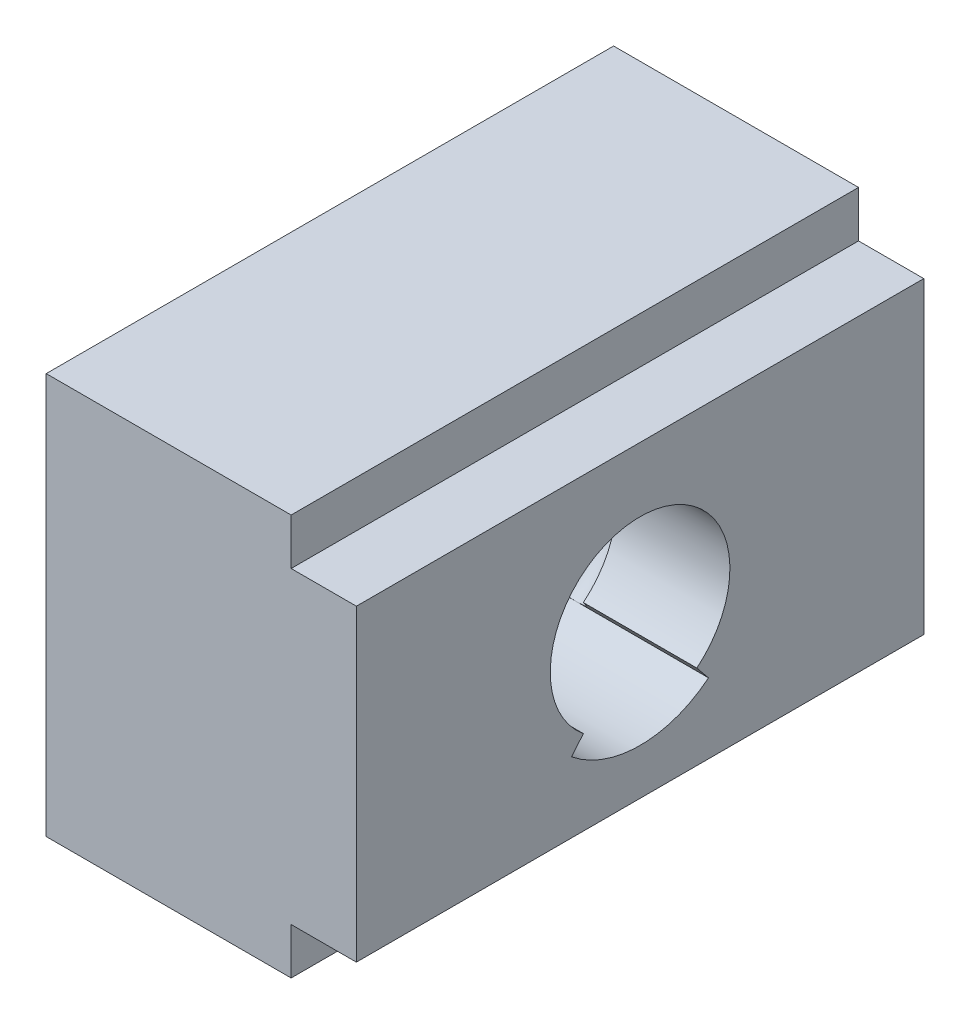
ISO-10303-21;
HEADER;
FILE_DESCRIPTION(('STEP AP214'),'2;1');
FILE_NAME('part.step','',(''),(''),'','','');
FILE_SCHEMA(('AUTOMOTIVE_DESIGN { 1 0 10303 214 1 1 1 1 }'));
ENDSEC;
DATA;
#1=APPLICATION_CONTEXT('core data for automotive mechanical design processes');
#2=APPLICATION_PROTOCOL_DEFINITION('international standard','automotive_design',2000,#1);
#3=PRODUCT_CONTEXT('',#1,'mechanical');
#4=PRODUCT('Part','Part','',(#3));
#5=PRODUCT_RELATED_PRODUCT_CATEGORY('part','',(#4));
#6=PRODUCT_DEFINITION_FORMATION('','',#4);
#7=PRODUCT_DEFINITION_CONTEXT('part definition',#1,'design');
#8=PRODUCT_DEFINITION('design','',#6,#7);
#9=PRODUCT_DEFINITION_SHAPE('','',#8);
#10=(LENGTH_UNIT() NAMED_UNIT(*) SI_UNIT(.MILLI.,.METRE.));
#11=(NAMED_UNIT(*) PLANE_ANGLE_UNIT() SI_UNIT($,.RADIAN.));
#12=(NAMED_UNIT(*) SI_UNIT($,.STERADIAN.) SOLID_ANGLE_UNIT());
#13=UNCERTAINTY_MEASURE_WITH_UNIT(LENGTH_MEASURE(1.E-05),#10,'distance_accuracy_value','');
#14=(GEOMETRIC_REPRESENTATION_CONTEXT(3) GLOBAL_UNCERTAINTY_ASSIGNED_CONTEXT((#13)) GLOBAL_UNIT_ASSIGNED_CONTEXT((#10,
#11,#12)) REPRESENTATION_CONTEXT('',''));
#15=CARTESIAN_POINT('',(0.,0.,0.));
#16=DIRECTION('',(0.,0.,1.));
#17=DIRECTION('',(1.,0.,0.));
#18=AXIS2_PLACEMENT_3D('',#15,#16,#17);
#19=CARTESIAN_POINT('',(-5.0613482463069,13.1033191731092,150.));
#20=DIRECTION('',(1.,0.,0.));
#21=DIRECTION('',(0.,0.,-1.));
#22=AXIS2_PLACEMENT_3D('',#19,#20,#21);
#23=CYLINDRICAL_SURFACE('',#22,47.5);
#24=CARTESIAN_POINT('',(-5.0613482463069,13.1033191731092,150.));
#25=DIRECTION('',(1.,0.,0.));
#26=DIRECTION('',(0.,0.,-1.));
#27=AXIS2_PLACEMENT_3D('',#24,#25,#26);
#28=CIRCLE('',#27,47.5);
#29=CARTESIAN_POINT('',(-5.0613482463069,-23.7239804835315,120.));
#30=VERTEX_POINT('',#29);
#31=CARTESIAN_POINT('',(-5.0613482463069,-23.7239804835314,180.));
#32=VERTEX_POINT('',#31);
#33=EDGE_CURVE('E141',#30,#32,#28,.T.);
#34=ORIENTED_EDGE('',*,*,#33,.F.);
#35=DIRECTION('',(1.,0.,0.));
#36=VECTOR('',#35,1.);
#37=CARTESIAN_POINT('',(-80.2349902408619,-23.7239804835315,120.));
#38=LINE('',#37,#36);
#39=CARTESIAN_POINT('',(14.9413028100581,-23.7239804835315,120.));
#40=VERTEX_POINT('',#39);
#41=EDGE_CURVE('E305',#30,#40,#38,.T.);
#42=ORIENTED_EDGE('',*,*,#41,.T.);
#43=CARTESIAN_POINT('',(14.9413028100581,13.1033191731092,150.));
#44=DIRECTION('',(1.,0.,0.));
#45=DIRECTION('',(0.,0.,-1.));
#46=AXIS2_PLACEMENT_3D('',#43,#44,#45);
#47=CIRCLE('',#46,47.5);
#48=CARTESIAN_POINT('',(14.9413028100581,-23.7239804835314,180.));
#49=VERTEX_POINT('',#48);
#50=EDGE_CURVE('E11',#49,#40,#47,.F.);
#51=ORIENTED_EDGE('',*,*,#50,.F.);
#52=DIRECTION('',(1.,0.,0.));
#53=VECTOR('',#52,1.);
#54=CARTESIAN_POINT('',(-80.2349902408619,-23.7239804835314,180.));
#55=LINE('',#54,#53);
#56=EDGE_CURVE('E231',#32,#49,#55,.T.);
#57=ORIENTED_EDGE('',*,*,#56,.F.);
#58=EDGE_LOOP('',(#34,#42,#51,#57));
#59=FACE_BOUND('',#58,.T.);
#60=ADVANCED_FACE('F36',(#59),#23,.F.);
#61=CARTESIAN_POINT('',(34.9360006973281,13.1033191731092,150.));
#62=DIRECTION('',(-1.,0.,0.));
#63=DIRECTION('',(0.,0.,1.));
#64=AXIS2_PLACEMENT_3D('',#61,#62,#63);
#65=CIRCLE('',#64,47.5);
#66=CARTESIAN_POINT('',(34.9360006973281,-23.7239804835315,120.));
#67=VERTEX_POINT('',#66);
#68=CARTESIAN_POINT('',(34.9360006973281,-23.7239804835314,180.));
#69=VERTEX_POINT('',#68);
#70=EDGE_CURVE('E45',#67,#69,#65,.F.);
#71=ORIENTED_EDGE('',*,*,#70,.F.);
#72=CARTESIAN_POINT('',(94.938651753693,-23.7239804835315,120.));
#73=VERTEX_POINT('',#72);
#74=EDGE_CURVE('E190',#67,#73,#38,.T.);
#75=ORIENTED_EDGE('',*,*,#74,.T.);
#76=CARTESIAN_POINT('',(94.938651753693,13.1033191731092,150.));
#77=DIRECTION('',(1.,0.,0.));
#78=DIRECTION('',(0.,0.,-1.));
#79=AXIS2_PLACEMENT_3D('',#76,#77,#78);
#80=CIRCLE('',#79,47.5);
#81=CARTESIAN_POINT('',(94.938651753693,-23.7239804835314,180.));
#82=VERTEX_POINT('',#81);
#83=EDGE_CURVE('E237',#73,#82,#80,.T.);
#84=ORIENTED_EDGE('',*,*,#83,.T.);
#85=EDGE_CURVE('E193',#69,#82,#55,.T.);
#86=ORIENTED_EDGE('',*,*,#85,.F.);
#87=EDGE_LOOP('',(#71,#75,#84,#86));
#88=FACE_BOUND('',#87,.T.);
#89=ADVANCED_FACE('F186',(#88),#23,.F.);
#90=CARTESIAN_POINT('',(94.938651753693,-68.3966808268909,300.));
#91=DIRECTION('',(-1.,0.,0.));
#92=DIRECTION('',(0.,0.,1.));
#93=AXIS2_PLACEMENT_3D('',#90,#91,#92);
#94=PLANE('',#93);
#95=ORIENTED_EDGE('',*,*,#83,.F.);
#96=DIRECTION('',(0.,0.77531157171875,0.63157894736842));
#97=VECTOR('',#96,1.);
#98=CARTESIAN_POINT('',(94.938651753693,-23.7239804835315,120.));
#99=LINE('',#98,#97);
#100=CARTESIAN_POINT('',(94.938651753693,-31.2985823331795,113.829630257768));
#101=VERTEX_POINT('',#100);
#102=EDGE_CURVE('E232',#101,#73,#99,.T.);
#103=ORIENTED_EDGE('',*,*,#102,.F.);
#104=CARTESIAN_POINT('',(94.938651753693,13.1033191731092,150.));
#105=DIRECTION('',(1.,0.,0.));
#106=DIRECTION('',(0.,0.,-1.));
#107=AXIS2_PLACEMENT_3D('',#104,#105,#106);
#108=CIRCLE('',#107,57.2697520918671);
#109=CARTESIAN_POINT('',(94.938651753693,-31.2985823331794,186.170369742232));
#110=VERTEX_POINT('',#109);
#111=EDGE_CURVE('E239',#110,#101,#108,.T.);
#112=ORIENTED_EDGE('',*,*,#111,.F.);
#113=DIRECTION('',(0.,-0.775311571718748,0.631578947368422));
#114=VECTOR('',#113,1.);
#115=CARTESIAN_POINT('',(94.938651753693,-23.7239804835314,180.));
#116=LINE('',#115,#114);
#117=EDGE_CURVE('E229',#82,#110,#116,.T.);
#118=ORIENTED_EDGE('',*,*,#117,.F.);
#119=EDGE_LOOP('',(#95,#103,#112,#118));
#120=FACE_BOUND('',#119,.T.);
#121=DIRECTION('',(0.,1.,0.));
#122=VECTOR('',#121,1.);
#123=CARTESIAN_POINT('',(94.938651753693,-68.3966808268909,0.));
#124=LINE('',#123,#122);
#125=CARTESIAN_POINT('',(94.938651753693,-68.3966808268909,0.));
#126=VERTEX_POINT('',#125);
#127=CARTESIAN_POINT('',(94.938651753693,94.6033191731092,0.));
#128=VERTEX_POINT('',#127);
#129=EDGE_CURVE('E137',#126,#128,#124,.T.);
#130=ORIENTED_EDGE('',*,*,#129,.T.);
#131=DIRECTION('',(0.,0.,-1.));
#132=VECTOR('',#131,1.);
#133=CARTESIAN_POINT('',(94.938651753693,94.6033191731092,300.));
#134=LINE('',#133,#132);
#135=CARTESIAN_POINT('',(94.938651753693,94.6033191731092,300.));
#136=VERTEX_POINT('',#135);
#137=EDGE_CURVE('E165',#136,#128,#134,.T.);
#138=ORIENTED_EDGE('',*,*,#137,.F.);
#139=DIRECTION('',(0.,1.,0.));
#140=VECTOR('',#139,1.);
#141=CARTESIAN_POINT('',(94.938651753693,-68.3966808268909,300.));
#142=LINE('',#141,#140);
#143=CARTESIAN_POINT('',(94.938651753693,-68.3966808268909,300.));
#144=VERTEX_POINT('',#143);
#145=EDGE_CURVE('E152',#144,#136,#142,.T.);
#146=ORIENTED_EDGE('',*,*,#145,.F.);
#147=DIRECTION('',(0.,0.,-1.));
#148=VECTOR('',#147,1.);
#149=CARTESIAN_POINT('',(94.938651753693,-68.3966808268909,300.));
#150=LINE('',#149,#148);
#151=EDGE_CURVE('E133',#144,#126,#150,.T.);
#152=ORIENTED_EDGE('',*,*,#151,.T.);
#153=EDGE_LOOP('',(#130,#138,#146,#152));
#154=FACE_BOUND('',#153,.T.);
#155=ADVANCED_FACE('F38',(#120,#154),#94,.F.);
#156=CARTESIAN_POINT('',(94.938651753693,94.6033191731092,300.));
#157=DIRECTION('',(0.,-1.,0.));
#158=DIRECTION('',(0.,0.,-1.));
#159=AXIS2_PLACEMENT_3D('',#156,#157,#158);
#160=PLANE('',#159);
#161=DIRECTION('',(-1.,0.,0.));
#162=VECTOR('',#161,1.);
#163=CARTESIAN_POINT('',(94.938651753693,94.6033191731092,0.));
#164=LINE('',#163,#162);
#165=CARTESIAN_POINT('',(60.438651753693,94.6033191731092,0.));
#166=VERTEX_POINT('',#165);
#167=EDGE_CURVE('E140',#128,#166,#164,.T.);
#168=ORIENTED_EDGE('',*,*,#167,.T.);
#169=DIRECTION('',(0.,0.,-1.));
#170=VECTOR('',#169,1.);
#171=CARTESIAN_POINT('',(60.438651753693,94.6033191731092,300.));
#172=LINE('',#171,#170);
#173=CARTESIAN_POINT('',(60.438651753693,94.6033191731092,300.));
#174=VERTEX_POINT('',#173);
#175=EDGE_CURVE('E162',#174,#166,#172,.T.);
#176=ORIENTED_EDGE('',*,*,#175,.F.);
#177=DIRECTION('',(-1.,0.,0.));
#178=VECTOR('',#177,1.);
#179=CARTESIAN_POINT('',(94.938651753693,94.6033191731092,300.));
#180=LINE('',#179,#178);
#181=EDGE_CURVE('E98',#136,#174,#180,.T.);
#182=ORIENTED_EDGE('',*,*,#181,.F.);
#183=ORIENTED_EDGE('',*,*,#137,.T.);
#184=EDGE_LOOP('',(#168,#176,#182,#183));
#185=FACE_BOUND('',#184,.T.);
#186=ADVANCED_FACE('F388',(#185),#160,.F.);
#187=CARTESIAN_POINT('',(60.438651753693,94.6033191731092,300.));
#188=DIRECTION('',(-1.,0.,0.));
#189=DIRECTION('',(0.,0.,1.));
#190=AXIS2_PLACEMENT_3D('',#187,#188,#189);
#191=PLANE('',#190);
#192=DIRECTION('',(0.,1.,0.));
#193=VECTOR('',#192,1.);
#194=CARTESIAN_POINT('',(60.438651753693,94.6033191731092,0.));
#195=LINE('',#194,#193);
#196=CARTESIAN_POINT('',(60.438651753693,119.103319173109,0.));
#197=VERTEX_POINT('',#196);
#198=EDGE_CURVE('E143',#166,#197,#195,.T.);
#199=ORIENTED_EDGE('',*,*,#198,.T.);
#200=DIRECTION('',(0.,0.,-1.));
#201=VECTOR('',#200,1.);
#202=CARTESIAN_POINT('',(60.438651753693,119.103319173109,300.));
#203=LINE('',#202,#201);
#204=CARTESIAN_POINT('',(60.438651753693,119.103319173109,300.));
#205=VERTEX_POINT('',#204);
#206=EDGE_CURVE('E159',#205,#197,#203,.T.);
#207=ORIENTED_EDGE('',*,*,#206,.F.);
#208=DIRECTION('',(0.,1.,0.));
#209=VECTOR('',#208,1.);
#210=CARTESIAN_POINT('',(60.438651753693,94.6033191731092,300.));
#211=LINE('',#210,#209);
#212=EDGE_CURVE('E249',#174,#205,#211,.T.);
#213=ORIENTED_EDGE('',*,*,#212,.F.);
#214=ORIENTED_EDGE('',*,*,#175,.T.);
#215=EDGE_LOOP('',(#199,#207,#213,#214));
#216=FACE_BOUND('',#215,.T.);
#217=ADVANCED_FACE('F442',(#216),#191,.F.);
#218=CARTESIAN_POINT('',(60.438651753693,119.103319173109,300.));
#219=DIRECTION('',(0.,-1.,0.));
#220=DIRECTION('',(1.,0.,0.));
#221=AXIS2_PLACEMENT_3D('',#218,#219,#220);
#222=PLANE('',#221);
#223=DIRECTION('',(-1.,0.,0.));
#224=VECTOR('',#223,1.);
#225=CARTESIAN_POINT('',(60.438651753693,119.103319173109,0.));
#226=LINE('',#225,#224);
#227=CARTESIAN_POINT('',(-69.061348246307,119.103319173109,0.));
#228=VERTEX_POINT('',#227);
#229=EDGE_CURVE('E145',#197,#228,#226,.T.);
#230=ORIENTED_EDGE('',*,*,#229,.T.);
#231=DIRECTION('',(0.,0.,-1.));
#232=VECTOR('',#231,1.);
#233=CARTESIAN_POINT('',(-69.061348246307,119.103319173109,300.));
#234=LINE('',#233,#232);
#235=CARTESIAN_POINT('',(-69.061348246307,119.103319173109,300.));
#236=VERTEX_POINT('',#235);
#237=EDGE_CURVE('E156',#236,#228,#234,.T.);
#238=ORIENTED_EDGE('',*,*,#237,.F.);
#239=DIRECTION('',(-1.,0.,0.));
#240=VECTOR('',#239,1.);
#241=CARTESIAN_POINT('',(60.438651753693,119.103319173109,300.));
#242=LINE('',#241,#240);
#243=EDGE_CURVE('E251',#205,#236,#242,.T.);
#244=ORIENTED_EDGE('',*,*,#243,.F.);
#245=ORIENTED_EDGE('',*,*,#206,.T.);
#246=EDGE_LOOP('',(#230,#238,#244,#245));
#247=FACE_BOUND('',#246,.T.);
#248=ADVANCED_FACE('F257',(#247),#222,.F.);
#249=CARTESIAN_POINT('',(-69.061348246307,119.103319173109,300.));
#250=DIRECTION('',(1.,0.,0.));
#251=DIRECTION('',(0.,1.,0.));
#252=AXIS2_PLACEMENT_3D('',#249,#250,#251);
#253=PLANE('',#252);
#254=DIRECTION('',(0.,-1.,0.));
#255=VECTOR('',#254,1.);
#256=CARTESIAN_POINT('',(-69.061348246307,119.103319173109,0.));
#257=LINE('',#256,#255);
#258=CARTESIAN_POINT('',(-69.061348246307,-92.8966808268908,0.));
#259=VERTEX_POINT('',#258);
#260=EDGE_CURVE('E147',#228,#259,#257,.T.);
#261=ORIENTED_EDGE('',*,*,#260,.T.);
#262=DIRECTION('',(0.,0.,-1.));
#263=VECTOR('',#262,1.);
#264=CARTESIAN_POINT('',(-69.061348246307,-92.8966808268908,300.));
#265=LINE('',#264,#263);
#266=CARTESIAN_POINT('',(-69.061348246307,-92.8966808268908,300.));
#267=VERTEX_POINT('',#266);
#268=EDGE_CURVE('E128',#267,#259,#265,.T.);
#269=ORIENTED_EDGE('',*,*,#268,.F.);
#270=DIRECTION('',(0.,-1.,0.));
#271=VECTOR('',#270,1.);
#272=CARTESIAN_POINT('',(-69.061348246307,119.103319173109,300.));
#273=LINE('',#272,#271);
#274=EDGE_CURVE('E119',#236,#267,#273,.T.);
#275=ORIENTED_EDGE('',*,*,#274,.F.);
#276=ORIENTED_EDGE('',*,*,#237,.T.);
#277=EDGE_LOOP('',(#261,#269,#275,#276));
#278=FACE_BOUND('',#277,.T.);
#279=ADVANCED_FACE('F261',(#278),#253,.F.);
#280=CARTESIAN_POINT('',(-69.061348246307,-92.8966808268908,300.));
#281=DIRECTION('',(0.,1.,0.));
#282=DIRECTION('',(-1.,0.,0.));
#283=AXIS2_PLACEMENT_3D('',#280,#281,#282);
#284=PLANE('',#283);
#285=DIRECTION('',(1.,0.,0.));
#286=VECTOR('',#285,1.);
#287=CARTESIAN_POINT('',(-69.061348246307,-92.8966808268908,0.));
#288=LINE('',#287,#286);
#289=CARTESIAN_POINT('',(60.438651753693,-92.8966808268909,0.));
#290=VERTEX_POINT('',#289);
#291=EDGE_CURVE('E127',#259,#290,#288,.T.);
#292=ORIENTED_EDGE('',*,*,#291,.T.);
#293=DIRECTION('',(0.,0.,-1.));
#294=VECTOR('',#293,1.);
#295=CARTESIAN_POINT('',(60.438651753693,-92.8966808268909,300.));
#296=LINE('',#295,#294);
#297=CARTESIAN_POINT('',(60.438651753693,-92.8966808268909,300.));
#298=VERTEX_POINT('',#297);
#299=EDGE_CURVE('E124',#298,#290,#296,.T.);
#300=ORIENTED_EDGE('',*,*,#299,.F.);
#301=DIRECTION('',(1.,0.,0.));
#302=VECTOR('',#301,1.);
#303=CARTESIAN_POINT('',(-69.061348246307,-92.8966808268908,300.));
#304=LINE('',#303,#302);
#305=EDGE_CURVE('E113',#267,#298,#304,.T.);
#306=ORIENTED_EDGE('',*,*,#305,.F.);
#307=ORIENTED_EDGE('',*,*,#268,.T.);
#308=EDGE_LOOP('',(#292,#300,#306,#307));
#309=FACE_BOUND('',#308,.T.);
#310=ADVANCED_FACE('F125',(#309),#284,.F.);
#311=CARTESIAN_POINT('',(60.438651753693,-92.8966808268909,300.));
#312=DIRECTION('',(-1.,0.,0.));
#313=DIRECTION('',(0.,-1.,0.));
#314=AXIS2_PLACEMENT_3D('',#311,#312,#313);
#315=PLANE('',#314);
#316=DIRECTION('',(0.,1.,0.));
#317=VECTOR('',#316,1.);
#318=CARTESIAN_POINT('',(60.438651753693,-92.8966808268909,0.));
#319=LINE('',#318,#317);
#320=CARTESIAN_POINT('',(60.4386517536929,-68.3966808268909,0.));
#321=VERTEX_POINT('',#320);
#322=EDGE_CURVE('E83',#290,#321,#319,.T.);
#323=ORIENTED_EDGE('',*,*,#322,.T.);
#324=DIRECTION('',(0.,0.,-1.));
#325=VECTOR('',#324,1.);
#326=CARTESIAN_POINT('',(60.4386517536929,-68.3966808268909,300.));
#327=LINE('',#326,#325);
#328=CARTESIAN_POINT('',(60.4386517536929,-68.3966808268909,300.));
#329=VERTEX_POINT('',#328);
#330=EDGE_CURVE('E129',#329,#321,#327,.T.);
#331=ORIENTED_EDGE('',*,*,#330,.F.);
#332=DIRECTION('',(0.,1.,0.));
#333=VECTOR('',#332,1.);
#334=CARTESIAN_POINT('',(60.438651753693,-92.8966808268909,300.));
#335=LINE('',#334,#333);
#336=EDGE_CURVE('E117',#298,#329,#335,.T.);
#337=ORIENTED_EDGE('',*,*,#336,.F.);
#338=ORIENTED_EDGE('',*,*,#299,.T.);
#339=EDGE_LOOP('',(#323,#331,#337,#338));
#340=FACE_BOUND('',#339,.T.);
#341=ADVANCED_FACE('F131',(#340),#315,.F.);
#342=CARTESIAN_POINT('',(60.4386517536929,-68.3966808268909,300.));
#343=DIRECTION('',(0.,1.,0.));
#344=DIRECTION('',(0.,0.,1.));
#345=AXIS2_PLACEMENT_3D('',#342,#343,#344);
#346=PLANE('',#345);
#347=DIRECTION('',(1.,0.,0.));
#348=VECTOR('',#347,1.);
#349=CARTESIAN_POINT('',(60.4386517536929,-68.3966808268909,0.));
#350=LINE('',#349,#348);
#351=EDGE_CURVE('E89',#321,#126,#350,.T.);
#352=ORIENTED_EDGE('',*,*,#351,.T.);
#353=ORIENTED_EDGE('',*,*,#151,.F.);
#354=DIRECTION('',(1.,0.,0.));
#355=VECTOR('',#354,1.);
#356=CARTESIAN_POINT('',(60.4386517536929,-68.3966808268909,300.));
#357=LINE('',#356,#355);
#358=EDGE_CURVE('E53',#329,#144,#357,.T.);
#359=ORIENTED_EDGE('',*,*,#358,.F.);
#360=ORIENTED_EDGE('',*,*,#330,.T.);
#361=EDGE_LOOP('',(#352,#353,#359,#360));
#362=FACE_BOUND('',#361,.T.);
#363=ADVANCED_FACE('F268',(#362),#346,.F.);
#364=CARTESIAN_POINT('',(0.,0.,300.));
#365=DIRECTION('',(0.,0.,1.));
#366=DIRECTION('',(1.,0.,0.));
#367=AXIS2_PLACEMENT_3D('',#364,#365,#366);
#368=PLANE('',#367);
#369=ORIENTED_EDGE('',*,*,#145,.T.);
#370=ORIENTED_EDGE('',*,*,#181,.T.);
#371=ORIENTED_EDGE('',*,*,#212,.T.);
#372=ORIENTED_EDGE('',*,*,#243,.T.);
#373=ORIENTED_EDGE('',*,*,#274,.T.);
#374=ORIENTED_EDGE('',*,*,#305,.T.);
#375=ORIENTED_EDGE('',*,*,#336,.T.);
#376=ORIENTED_EDGE('',*,*,#358,.T.);
#377=EDGE_LOOP('',(#369,#370,#371,#372,#373,#374,#375,#376));
#378=FACE_BOUND('',#377,.T.);
#379=ADVANCED_FACE('F115',(#378),#368,.T.);
#380=CARTESIAN_POINT('',(0.,0.,0.));
#381=DIRECTION('',(0.,0.,1.));
#382=DIRECTION('',(1.,0.,0.));
#383=AXIS2_PLACEMENT_3D('',#380,#381,#382);
#384=PLANE('',#383);
#385=ORIENTED_EDGE('',*,*,#129,.F.);
#386=ORIENTED_EDGE('',*,*,#351,.F.);
#387=ORIENTED_EDGE('',*,*,#322,.F.);
#388=ORIENTED_EDGE('',*,*,#291,.F.);
#389=ORIENTED_EDGE('',*,*,#260,.F.);
#390=ORIENTED_EDGE('',*,*,#229,.F.);
#391=ORIENTED_EDGE('',*,*,#198,.F.);
#392=ORIENTED_EDGE('',*,*,#167,.F.);
#393=EDGE_LOOP('',(#385,#386,#387,#388,#389,#390,#391,#392));
#394=FACE_BOUND('',#393,.T.);
#395=ADVANCED_FACE('F264',(#394),#384,.F.);
#396=CARTESIAN_POINT('',(-5.0613482463069,13.1033191731092,150.));
#397=DIRECTION('',(1.,0.,0.));
#398=DIRECTION('',(0.,0.,-1.));
#399=AXIS2_PLACEMENT_3D('',#396,#397,#398);
#400=PLANE('',#399);
#401=ORIENTED_EDGE('',*,*,#33,.T.);
#402=DIRECTION('',(0.,0.775311571718748,-0.631578947368422));
#403=VECTOR('',#402,1.);
#404=CARTESIAN_POINT('',(-5.0613482463069,-23.7239804835314,180.));
#405=LINE('',#404,#403);
#406=CARTESIAN_POINT('',(-5.0613482463069,-31.2985823331794,186.170369742232));
#407=VERTEX_POINT('',#406);
#408=EDGE_CURVE('E299',#407,#32,#405,.T.);
#409=ORIENTED_EDGE('',*,*,#408,.F.);
#410=CARTESIAN_POINT('',(-5.0613482463069,13.1033191731092,150.));
#411=DIRECTION('',(1.,0.,0.));
#412=DIRECTION('',(0.,0.,-1.));
#413=AXIS2_PLACEMENT_3D('',#410,#411,#412);
#414=CIRCLE('',#413,57.2697520918671);
#415=CARTESIAN_POINT('',(-5.0613482463069,-31.2985823331795,113.829630257768));
#416=VERTEX_POINT('',#415);
#417=EDGE_CURVE('E320',#416,#407,#414,.F.);
#418=ORIENTED_EDGE('',*,*,#417,.F.);
#419=DIRECTION('',(0.,-0.77531157171875,-0.63157894736842));
#420=VECTOR('',#419,1.);
#421=CARTESIAN_POINT('',(-5.0613482463069,-23.7239804835315,120.));
#422=LINE('',#421,#420);
#423=EDGE_CURVE('E300',#30,#416,#422,.T.);
#424=ORIENTED_EDGE('',*,*,#423,.F.);
#425=EDGE_LOOP('',(#401,#409,#418,#424));
#426=FACE_BOUND('',#425,.T.);
#427=ADVANCED_FACE('F286',(#426),#400,.T.);
#428=CARTESIAN_POINT('',(24.9386517536931,13.1033191731092,150.));
#429=DIRECTION('',(-1.,0.,0.));
#430=DIRECTION('',(0.,0.,1.));
#431=AXIS2_PLACEMENT_3D('',#428,#429,#430);
#432=TOROIDAL_SURFACE('',#431,47.2697520918671,10.);
#433=ORIENTED_EDGE('',*,*,#50,.T.);
#434=CARTESIAN_POINT('',(24.9386517536931,-23.545466615992,120.145419731452));
#435=DIRECTION('',(0.,0.63157894736842,-0.77531157171875));
#436=DIRECTION('',(1.,0.,0.));
#437=AXIS2_PLACEMENT_3D('',#434,#435,#436);
#438=CIRCLE('',#437,10.);
#439=CARTESIAN_POINT('',(24.9386517536931,-31.2985823331795,113.829630257768));
#440=VERTEX_POINT('',#439);
#441=EDGE_CURVE('E244',#440,#40,#438,.T.);
#442=ORIENTED_EDGE('',*,*,#441,.F.);
#443=EDGE_CURVE('E180',#67,#440,#438,.T.);
#444=ORIENTED_EDGE('',*,*,#443,.F.);
#445=ORIENTED_EDGE('',*,*,#70,.T.);
#446=CARTESIAN_POINT('',(24.9386517536931,-23.5454666159919,179.854580268548));
#447=DIRECTION('',(0.,-0.631578947368421,-0.775311571718749));
#448=DIRECTION('',(1.,0.,0.));
#449=AXIS2_PLACEMENT_3D('',#446,#447,#448);
#450=CIRCLE('',#449,10.);
#451=CARTESIAN_POINT('',(24.9386517536931,-31.2985823331794,186.170369742232));
#452=VERTEX_POINT('',#451);
#453=EDGE_CURVE('E176',#69,#452,#450,.T.);
#454=ORIENTED_EDGE('',*,*,#453,.T.);
#455=EDGE_CURVE('E313',#452,#49,#450,.T.);
#456=ORIENTED_EDGE('',*,*,#455,.T.);
#457=EDGE_LOOP('',(#433,#442,#444,#445,#454,#456));
#458=FACE_BOUND('',#457,.T.);
#459=ADVANCED_FACE('F172',(#458),#432,.F.);
#460=CARTESIAN_POINT('',(-80.2349902408619,-23.7239804835315,120.));
#461=DIRECTION('',(0.,0.63157894736842,-0.77531157171875));
#462=DIRECTION('',(0.,0.77531157171875,0.63157894736842));
#463=AXIS2_PLACEMENT_3D('',#460,#461,#462);
#464=PLANE('',#463);
#465=ORIENTED_EDGE('',*,*,#443,.T.);
#466=DIRECTION('',(1.,0.,0.));
#467=VECTOR('',#466,1.);
#468=CARTESIAN_POINT('',(-80.2349902408619,-31.2985823331795,113.829630257768));
#469=LINE('',#468,#467);
#470=EDGE_CURVE('E321',#440,#101,#469,.T.);
#471=ORIENTED_EDGE('',*,*,#470,.T.);
#472=ORIENTED_EDGE('',*,*,#102,.T.);
#473=ORIENTED_EDGE('',*,*,#74,.F.);
#474=EDGE_LOOP('',(#465,#471,#472,#473));
#475=FACE_BOUND('',#474,.T.);
#476=ADVANCED_FACE('F296',(#475),#464,.F.);
#477=CARTESIAN_POINT('',(-80.2349902408619,-23.7239804835314,180.));
#478=DIRECTION('',(0.,0.631578947368422,0.775311571718748));
#479=DIRECTION('',(0.,-0.775311571718748,0.631578947368422));
#480=AXIS2_PLACEMENT_3D('',#477,#478,#479);
#481=PLANE('',#480);
#482=ORIENTED_EDGE('',*,*,#453,.F.);
#483=ORIENTED_EDGE('',*,*,#85,.T.);
#484=ORIENTED_EDGE('',*,*,#117,.T.);
#485=DIRECTION('',(1.,0.,0.));
#486=VECTOR('',#485,1.);
#487=CARTESIAN_POINT('',(-80.2349902408619,-31.2985823331794,186.170369742232));
#488=LINE('',#487,#486);
#489=EDGE_CURVE('E307',#452,#110,#488,.T.);
#490=ORIENTED_EDGE('',*,*,#489,.F.);
#491=EDGE_LOOP('',(#482,#483,#484,#490));
#492=FACE_BOUND('',#491,.T.);
#493=ADVANCED_FACE('F227',(#492),#481,.F.);
#494=ORIENTED_EDGE('',*,*,#441,.T.);
#495=ORIENTED_EDGE('',*,*,#41,.F.);
#496=ORIENTED_EDGE('',*,*,#423,.T.);
#497=EDGE_CURVE('E322',#416,#440,#469,.T.);
#498=ORIENTED_EDGE('',*,*,#497,.T.);
#499=EDGE_LOOP('',(#494,#495,#496,#498));
#500=FACE_BOUND('',#499,.T.);
#501=ADVANCED_FACE('F331',(#500),#464,.F.);
#502=CARTESIAN_POINT('',(-80.2349902408619,13.1033191731092,150.));
#503=DIRECTION('',(1.,0.,0.));
#504=DIRECTION('',(0.,0.,-1.));
#505=AXIS2_PLACEMENT_3D('',#502,#503,#504);
#506=CYLINDRICAL_SURFACE('',#505,57.2697520918671);
#507=ORIENTED_EDGE('',*,*,#417,.T.);
#508=EDGE_CURVE('E308',#407,#452,#488,.T.);
#509=ORIENTED_EDGE('',*,*,#508,.T.);
#510=ORIENTED_EDGE('',*,*,#489,.T.);
#511=ORIENTED_EDGE('',*,*,#111,.T.);
#512=ORIENTED_EDGE('',*,*,#470,.F.);
#513=ORIENTED_EDGE('',*,*,#497,.F.);
#514=EDGE_LOOP('',(#507,#509,#510,#511,#512,#513));
#515=FACE_BOUND('',#514,.T.);
#516=ADVANCED_FACE('F318',(#515),#506,.F.);
#517=ORIENTED_EDGE('',*,*,#455,.F.);
#518=ORIENTED_EDGE('',*,*,#508,.F.);
#519=ORIENTED_EDGE('',*,*,#408,.T.);
#520=ORIENTED_EDGE('',*,*,#56,.T.);
#521=EDGE_LOOP('',(#517,#518,#519,#520));
#522=FACE_BOUND('',#521,.T.);
#523=ADVANCED_FACE('F315',(#522),#481,.F.);
#524=CLOSED_SHELL('',(#60,#89,#155,#186,#217,#248,#279,#310,#341,#363,#379,#395,#427,#459,#476,
#493,#501,#516,#523));
#525=MANIFOLD_SOLID_BREP('B2',#524);
#526=ADVANCED_BREP_SHAPE_REPRESENTATION('',(#18,#525),#14);
#527=SHAPE_DEFINITION_REPRESENTATION(#9,#526);
ENDSEC;
END-ISO-10303-21;
